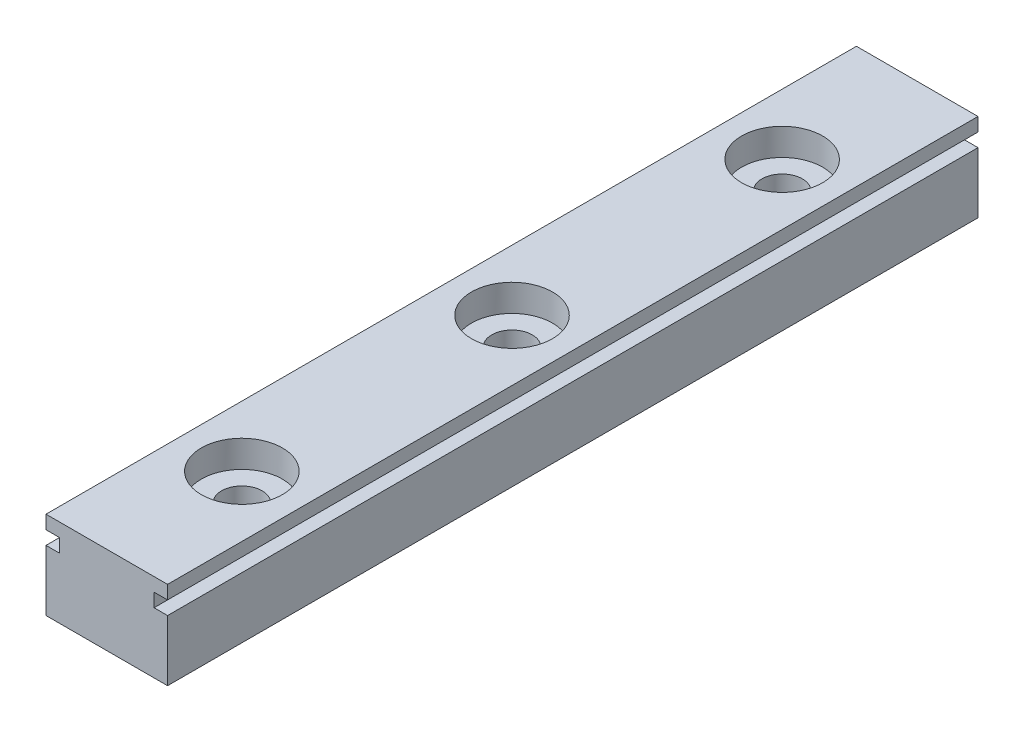
ISO-10303-21;
HEADER;
FILE_DESCRIPTION(('STEP AP214'),'2;1');
FILE_NAME('part.step','',(''),(''),'','','');
FILE_SCHEMA(('AUTOMOTIVE_DESIGN { 1 0 10303 214 1 1 1 1 }'));
ENDSEC;
DATA;
#1=APPLICATION_CONTEXT('core data for automotive mechanical design processes');
#2=APPLICATION_PROTOCOL_DEFINITION('international standard','automotive_design',2000,#1);
#3=PRODUCT_CONTEXT('',#1,'mechanical');
#4=PRODUCT('Part','Part','',(#3));
#5=PRODUCT_RELATED_PRODUCT_CATEGORY('part','',(#4));
#6=PRODUCT_DEFINITION_FORMATION('','',#4);
#7=PRODUCT_DEFINITION_CONTEXT('part definition',#1,'design');
#8=PRODUCT_DEFINITION('design','',#6,#7);
#9=PRODUCT_DEFINITION_SHAPE('','',#8);
#10=(LENGTH_UNIT() NAMED_UNIT(*) SI_UNIT(.MILLI.,.METRE.));
#11=(NAMED_UNIT(*) PLANE_ANGLE_UNIT() SI_UNIT($,.RADIAN.));
#12=(NAMED_UNIT(*) SI_UNIT($,.STERADIAN.) SOLID_ANGLE_UNIT());
#13=UNCERTAINTY_MEASURE_WITH_UNIT(LENGTH_MEASURE(1.E-05),#10,'distance_accuracy_value','');
#14=(GEOMETRIC_REPRESENTATION_CONTEXT(3) GLOBAL_UNCERTAINTY_ASSIGNED_CONTEXT((#13)) GLOBAL_UNIT_ASSIGNED_CONTEXT((#10,
#11,#12)) REPRESENTATION_CONTEXT('',''));
#15=CARTESIAN_POINT('',(0.,0.,0.));
#16=DIRECTION('',(0.,0.,1.));
#17=DIRECTION('',(1.,0.,0.));
#18=AXIS2_PLACEMENT_3D('',#15,#16,#17);
#19=CARTESIAN_POINT('',(3.5,5.5,60.));
#20=DIRECTION('',(-1.,0.,0.));
#21=DIRECTION('',(0.,0.,1.));
#22=AXIS2_PLACEMENT_3D('',#19,#20,#21);
#23=PLANE('',#22);
#24=DIRECTION('',(0.,1.,0.));
#25=VECTOR('',#24,1.);
#26=CARTESIAN_POINT('',(3.5,5.5,0.));
#27=LINE('',#26,#25);
#28=CARTESIAN_POINT('',(3.5,4.5,0.));
#29=VERTEX_POINT('',#28);
#30=CARTESIAN_POINT('',(3.5,5.5,0.));
#31=VERTEX_POINT('',#30);
#32=EDGE_CURVE('E157',#29,#31,#27,.T.);
#33=ORIENTED_EDGE('',*,*,#32,.T.);
#34=DIRECTION('',(0.,0.,-1.));
#35=VECTOR('',#34,1.);
#36=CARTESIAN_POINT('',(3.5,5.5,60.));
#37=LINE('',#36,#35);
#38=CARTESIAN_POINT('',(3.5,5.5,60.));
#39=VERTEX_POINT('',#38);
#40=EDGE_CURVE('E11',#39,#31,#37,.T.);
#41=ORIENTED_EDGE('',*,*,#40,.F.);
#42=DIRECTION('',(0.,1.,0.));
#43=VECTOR('',#42,1.);
#44=CARTESIAN_POINT('',(3.5,5.5,60.));
#45=LINE('',#44,#43);
#46=CARTESIAN_POINT('',(3.5,4.5,60.));
#47=VERTEX_POINT('',#46);
#48=EDGE_CURVE('E180',#47,#39,#45,.T.);
#49=ORIENTED_EDGE('',*,*,#48,.F.);
#50=DIRECTION('',(0.,0.,-1.));
#51=VECTOR('',#50,1.);
#52=CARTESIAN_POINT('',(3.5,4.5,60.));
#53=LINE('',#52,#51);
#54=EDGE_CURVE('E153',#47,#29,#53,.T.);
#55=ORIENTED_EDGE('',*,*,#54,.T.);
#56=EDGE_LOOP('',(#33,#41,#49,#55));
#57=FACE_BOUND('',#56,.T.);
#58=ADVANCED_FACE('F37',(#57),#23,.F.);
#59=CARTESIAN_POINT('',(4.5,5.5,60.));
#60=DIRECTION('',(0.,1.,0.));
#61=DIRECTION('',(-1.,0.,0.));
#62=AXIS2_PLACEMENT_3D('',#59,#60,#61);
#63=PLANE('',#62);
#64=DIRECTION('',(1.,0.,0.));
#65=VECTOR('',#64,1.);
#66=CARTESIAN_POINT('',(4.5,5.5,0.));
#67=LINE('',#66,#65);
#68=CARTESIAN_POINT('',(4.5,5.5,0.));
#69=VERTEX_POINT('',#68);
#70=EDGE_CURVE('E160',#31,#69,#67,.T.);
#71=ORIENTED_EDGE('',*,*,#70,.T.);
#72=DIRECTION('',(0.,0.,-1.));
#73=VECTOR('',#72,1.);
#74=CARTESIAN_POINT('',(4.5,5.5,60.));
#75=LINE('',#74,#73);
#76=CARTESIAN_POINT('',(4.5,5.5,60.));
#77=VERTEX_POINT('',#76);
#78=EDGE_CURVE('E45',#77,#69,#75,.T.);
#79=ORIENTED_EDGE('',*,*,#78,.F.);
#80=DIRECTION('',(1.,0.,0.));
#81=VECTOR('',#80,1.);
#82=CARTESIAN_POINT('',(4.5,5.5,60.));
#83=LINE('',#82,#81);
#84=EDGE_CURVE('E108',#39,#77,#83,.T.);
#85=ORIENTED_EDGE('',*,*,#84,.F.);
#86=ORIENTED_EDGE('',*,*,#40,.T.);
#87=EDGE_LOOP('',(#71,#79,#85,#86));
#88=FACE_BOUND('',#87,.T.);
#89=ADVANCED_FACE('F258',(#88),#63,.F.);
#90=CARTESIAN_POINT('',(4.5,6.5,60.));
#91=DIRECTION('',(-1.,0.,0.));
#92=DIRECTION('',(0.,0.,1.));
#93=AXIS2_PLACEMENT_3D('',#90,#91,#92);
#94=PLANE('',#93);
#95=DIRECTION('',(0.,1.,0.));
#96=VECTOR('',#95,1.);
#97=CARTESIAN_POINT('',(4.5,6.5,0.));
#98=LINE('',#97,#96);
#99=CARTESIAN_POINT('',(4.5,6.5,0.));
#100=VERTEX_POINT('',#99);
#101=EDGE_CURVE('E163',#69,#100,#98,.T.);
#102=ORIENTED_EDGE('',*,*,#101,.T.);
#103=DIRECTION('',(0.,0.,-1.));
#104=VECTOR('',#103,1.);
#105=CARTESIAN_POINT('',(4.5,6.5,60.));
#106=LINE('',#105,#104);
#107=CARTESIAN_POINT('',(4.5,6.5,60.));
#108=VERTEX_POINT('',#107);
#109=EDGE_CURVE('E199',#108,#100,#106,.T.);
#110=ORIENTED_EDGE('',*,*,#109,.F.);
#111=DIRECTION('',(0.,1.,0.));
#112=VECTOR('',#111,1.);
#113=CARTESIAN_POINT('',(4.5,6.5,60.));
#114=LINE('',#113,#112);
#115=EDGE_CURVE('E207',#77,#108,#114,.T.);
#116=ORIENTED_EDGE('',*,*,#115,.F.);
#117=ORIENTED_EDGE('',*,*,#78,.T.);
#118=EDGE_LOOP('',(#102,#110,#116,#117));
#119=FACE_BOUND('',#118,.T.);
#120=ADVANCED_FACE('F205',(#119),#94,.F.);
#121=CARTESIAN_POINT('',(4.5,6.5,60.));
#122=DIRECTION('',(0.,-1.,0.));
#123=DIRECTION('',(0.,0.,-1.));
#124=AXIS2_PLACEMENT_3D('',#121,#122,#123);
#125=PLANE('',#124);
#126=CARTESIAN_POINT('',(0.,6.5,10.));
#127=DIRECTION('',(0.,1.,0.));
#128=DIRECTION('',(0.,0.,1.));
#129=AXIS2_PLACEMENT_3D('',#126,#127,#128);
#130=CIRCLE('',#129,3.);
#131=CARTESIAN_POINT('',(0.,6.5,13.));
#132=VERTEX_POINT('',#131);
#133=EDGE_CURVE('E312',#132,#132,#130,.T.);
#134=ORIENTED_EDGE('',*,*,#133,.F.);
#135=EDGE_LOOP('',(#134));
#136=FACE_BOUND('',#135,.T.);
#137=CARTESIAN_POINT('',(2.09488880330588E-13,6.5,30.));
#138=DIRECTION('',(0.,1.,0.));
#139=DIRECTION('',(0.,0.,1.));
#140=AXIS2_PLACEMENT_3D('',#137,#138,#139);
#141=CIRCLE('',#140,3.);
#142=CARTESIAN_POINT('',(2.09488880330588E-13,6.5,33.));
#143=VERTEX_POINT('',#142);
#144=EDGE_CURVE('E324',#143,#143,#141,.T.);
#145=ORIENTED_EDGE('',*,*,#144,.F.);
#146=EDGE_LOOP('',(#145));
#147=FACE_BOUND('',#146,.T.);
#148=CARTESIAN_POINT('',(4.18977760661176E-13,6.5,50.));
#149=DIRECTION('',(0.,1.,0.));
#150=DIRECTION('',(0.,0.,1.));
#151=AXIS2_PLACEMENT_3D('',#148,#149,#150);
#152=CIRCLE('',#151,3.);
#153=CARTESIAN_POINT('',(4.18977760661176E-13,6.5,53.));
#154=VERTEX_POINT('',#153);
#155=EDGE_CURVE('E318',#154,#154,#152,.T.);
#156=ORIENTED_EDGE('',*,*,#155,.F.);
#157=EDGE_LOOP('',(#156));
#158=FACE_BOUND('',#157,.T.);
#159=DIRECTION('',(-1.,0.,0.));
#160=VECTOR('',#159,1.);
#161=CARTESIAN_POINT('',(4.5,6.5,0.));
#162=LINE('',#161,#160);
#163=CARTESIAN_POINT('',(-4.5,6.5,0.));
#164=VERTEX_POINT('',#163);
#165=EDGE_CURVE('E165',#100,#164,#162,.T.);
#166=ORIENTED_EDGE('',*,*,#165,.T.);
#167=DIRECTION('',(0.,0.,-1.));
#168=VECTOR('',#167,1.);
#169=CARTESIAN_POINT('',(-4.5,6.5,60.));
#170=LINE('',#169,#168);
#171=CARTESIAN_POINT('',(-4.5,6.5,60.));
#172=VERTEX_POINT('',#171);
#173=EDGE_CURVE('E196',#172,#164,#170,.T.);
#174=ORIENTED_EDGE('',*,*,#173,.F.);
#175=DIRECTION('',(-1.,0.,0.));
#176=VECTOR('',#175,1.);
#177=CARTESIAN_POINT('',(4.5,6.5,60.));
#178=LINE('',#177,#176);
#179=EDGE_CURVE('E225',#108,#172,#178,.T.);
#180=ORIENTED_EDGE('',*,*,#179,.F.);
#181=ORIENTED_EDGE('',*,*,#109,.T.);
#182=EDGE_LOOP('',(#166,#174,#180,#181));
#183=FACE_BOUND('',#182,.T.);
#184=ADVANCED_FACE('F216',(#136,#147,#158,#183),#125,.F.);
#185=CARTESIAN_POINT('',(-4.5,6.5,60.));
#186=DIRECTION('',(1.,0.,0.));
#187=DIRECTION('',(0.,0.,-1.));
#188=AXIS2_PLACEMENT_3D('',#185,#186,#187);
#189=PLANE('',#188);
#190=DIRECTION('',(0.,-1.,0.));
#191=VECTOR('',#190,1.);
#192=CARTESIAN_POINT('',(-4.5,6.5,0.));
#193=LINE('',#192,#191);
#194=CARTESIAN_POINT('',(-4.5,5.5,0.));
#195=VERTEX_POINT('',#194);
#196=EDGE_CURVE('E167',#164,#195,#193,.T.);
#197=ORIENTED_EDGE('',*,*,#196,.T.);
#198=DIRECTION('',(0.,0.,-1.));
#199=VECTOR('',#198,1.);
#200=CARTESIAN_POINT('',(-4.5,5.5,60.));
#201=LINE('',#200,#199);
#202=CARTESIAN_POINT('',(-4.5,5.5,60.));
#203=VERTEX_POINT('',#202);
#204=EDGE_CURVE('E193',#203,#195,#201,.T.);
#205=ORIENTED_EDGE('',*,*,#204,.F.);
#206=DIRECTION('',(0.,-1.,0.));
#207=VECTOR('',#206,1.);
#208=CARTESIAN_POINT('',(-4.5,6.5,60.));
#209=LINE('',#208,#207);
#210=EDGE_CURVE('E222',#172,#203,#209,.T.);
#211=ORIENTED_EDGE('',*,*,#210,.F.);
#212=ORIENTED_EDGE('',*,*,#173,.T.);
#213=EDGE_LOOP('',(#197,#205,#211,#212));
#214=FACE_BOUND('',#213,.T.);
#215=ADVANCED_FACE('F220',(#214),#189,.F.);
#216=CARTESIAN_POINT('',(-4.5,5.5,60.));
#217=DIRECTION('',(0.,1.,0.));
#218=DIRECTION('',(-1.,0.,0.));
#219=AXIS2_PLACEMENT_3D('',#216,#217,#218);
#220=PLANE('',#219);
#221=DIRECTION('',(1.,0.,0.));
#222=VECTOR('',#221,1.);
#223=CARTESIAN_POINT('',(-4.5,5.5,0.));
#224=LINE('',#223,#222);
#225=CARTESIAN_POINT('',(-3.5,5.5,0.));
#226=VERTEX_POINT('',#225);
#227=EDGE_CURVE('E169',#195,#226,#224,.T.);
#228=ORIENTED_EDGE('',*,*,#227,.T.);
#229=DIRECTION('',(0.,0.,-1.));
#230=VECTOR('',#229,1.);
#231=CARTESIAN_POINT('',(-3.5,5.5,60.));
#232=LINE('',#231,#230);
#233=CARTESIAN_POINT('',(-3.5,5.5,60.));
#234=VERTEX_POINT('',#233);
#235=EDGE_CURVE('E190',#234,#226,#232,.T.);
#236=ORIENTED_EDGE('',*,*,#235,.F.);
#237=DIRECTION('',(1.,0.,0.));
#238=VECTOR('',#237,1.);
#239=CARTESIAN_POINT('',(-4.5,5.5,60.));
#240=LINE('',#239,#238);
#241=EDGE_CURVE('E224',#203,#234,#240,.T.);
#242=ORIENTED_EDGE('',*,*,#241,.F.);
#243=ORIENTED_EDGE('',*,*,#204,.T.);
#244=EDGE_LOOP('',(#228,#236,#242,#243));
#245=FACE_BOUND('',#244,.T.);
#246=ADVANCED_FACE('F272',(#245),#220,.F.);
#247=CARTESIAN_POINT('',(-3.5,5.5,60.));
#248=DIRECTION('',(1.,0.,0.));
#249=DIRECTION('',(0.,0.,-1.));
#250=AXIS2_PLACEMENT_3D('',#247,#248,#249);
#251=PLANE('',#250);
#252=DIRECTION('',(0.,-1.,0.));
#253=VECTOR('',#252,1.);
#254=CARTESIAN_POINT('',(-3.5,5.5,0.));
#255=LINE('',#254,#253);
#256=CARTESIAN_POINT('',(-3.5,4.5,0.));
#257=VERTEX_POINT('',#256);
#258=EDGE_CURVE('E171',#226,#257,#255,.T.);
#259=ORIENTED_EDGE('',*,*,#258,.T.);
#260=DIRECTION('',(0.,0.,-1.));
#261=VECTOR('',#260,1.);
#262=CARTESIAN_POINT('',(-3.5,4.5,60.));
#263=LINE('',#262,#261);
#264=CARTESIAN_POINT('',(-3.5,4.5,60.));
#265=VERTEX_POINT('',#264);
#266=EDGE_CURVE('E187',#265,#257,#263,.T.);
#267=ORIENTED_EDGE('',*,*,#266,.F.);
#268=DIRECTION('',(0.,-1.,0.));
#269=VECTOR('',#268,1.);
#270=CARTESIAN_POINT('',(-3.5,5.5,60.));
#271=LINE('',#270,#269);
#272=EDGE_CURVE('E227',#234,#265,#271,.T.);
#273=ORIENTED_EDGE('',*,*,#272,.F.);
#274=ORIENTED_EDGE('',*,*,#235,.T.);
#275=EDGE_LOOP('',(#259,#267,#273,#274));
#276=FACE_BOUND('',#275,.T.);
#277=ADVANCED_FACE('F275',(#276),#251,.F.);
#278=CARTESIAN_POINT('',(-3.5,4.5,60.));
#279=DIRECTION('',(0.,-1.,0.));
#280=DIRECTION('',(0.,0.,-1.));
#281=AXIS2_PLACEMENT_3D('',#278,#279,#280);
#282=PLANE('',#281);
#283=DIRECTION('',(-1.,0.,0.));
#284=VECTOR('',#283,1.);
#285=CARTESIAN_POINT('',(-3.5,4.5,0.));
#286=LINE('',#285,#284);
#287=CARTESIAN_POINT('',(-4.5,4.5,0.));
#288=VERTEX_POINT('',#287);
#289=EDGE_CURVE('E173',#257,#288,#286,.T.);
#290=ORIENTED_EDGE('',*,*,#289,.T.);
#291=DIRECTION('',(0.,0.,-1.));
#292=VECTOR('',#291,1.);
#293=CARTESIAN_POINT('',(-4.5,4.5,60.));
#294=LINE('',#293,#292);
#295=CARTESIAN_POINT('',(-4.5,4.5,60.));
#296=VERTEX_POINT('',#295);
#297=EDGE_CURVE('E184',#296,#288,#294,.T.);
#298=ORIENTED_EDGE('',*,*,#297,.F.);
#299=DIRECTION('',(-1.,0.,0.));
#300=VECTOR('',#299,1.);
#301=CARTESIAN_POINT('',(-3.5,4.5,60.));
#302=LINE('',#301,#300);
#303=EDGE_CURVE('E233',#265,#296,#302,.T.);
#304=ORIENTED_EDGE('',*,*,#303,.F.);
#305=ORIENTED_EDGE('',*,*,#266,.T.);
#306=EDGE_LOOP('',(#290,#298,#304,#305));
#307=FACE_BOUND('',#306,.T.);
#308=ADVANCED_FACE('F239',(#307),#282,.F.);
#309=CARTESIAN_POINT('',(-4.5,4.5,60.));
#310=DIRECTION('',(1.,0.,0.));
#311=DIRECTION('',(0.,1.,0.));
#312=AXIS2_PLACEMENT_3D('',#309,#310,#311);
#313=PLANE('',#312);
#314=DIRECTION('',(0.,-1.,0.));
#315=VECTOR('',#314,1.);
#316=CARTESIAN_POINT('',(-4.5,4.5,0.));
#317=LINE('',#316,#315);
#318=CARTESIAN_POINT('',(-4.5,0.,0.));
#319=VERTEX_POINT('',#318);
#320=EDGE_CURVE('E175',#288,#319,#317,.T.);
#321=ORIENTED_EDGE('',*,*,#320,.T.);
#322=DIRECTION('',(0.,0.,-1.));
#323=VECTOR('',#322,1.);
#324=CARTESIAN_POINT('',(-4.5,0.,60.));
#325=LINE('',#324,#323);
#326=CARTESIAN_POINT('',(-4.5,0.,60.));
#327=VERTEX_POINT('',#326);
#328=EDGE_CURVE('E148',#327,#319,#325,.T.);
#329=ORIENTED_EDGE('',*,*,#328,.F.);
#330=DIRECTION('',(0.,-1.,0.));
#331=VECTOR('',#330,1.);
#332=CARTESIAN_POINT('',(-4.5,4.5,60.));
#333=LINE('',#332,#331);
#334=EDGE_CURVE('E139',#296,#327,#333,.T.);
#335=ORIENTED_EDGE('',*,*,#334,.F.);
#336=ORIENTED_EDGE('',*,*,#297,.T.);
#337=EDGE_LOOP('',(#321,#329,#335,#336));
#338=FACE_BOUND('',#337,.T.);
#339=ADVANCED_FACE('F243',(#338),#313,.F.);
#340=CARTESIAN_POINT('',(-4.5,0.,60.));
#341=DIRECTION('',(0.,1.,0.));
#342=DIRECTION('',(0.,0.,1.));
#343=AXIS2_PLACEMENT_3D('',#340,#341,#342);
#344=PLANE('',#343);
#345=CARTESIAN_POINT('',(0.,0.,10.));
#346=DIRECTION('',(0.,1.,0.));
#347=DIRECTION('',(0.,0.,1.));
#348=AXIS2_PLACEMENT_3D('',#345,#346,#347);
#349=CIRCLE('',#348,1.5);
#350=CARTESIAN_POINT('',(0.,0.,11.5));
#351=VERTEX_POINT('',#350);
#352=EDGE_CURVE('E291',#351,#351,#349,.T.);
#353=ORIENTED_EDGE('',*,*,#352,.T.);
#354=EDGE_LOOP('',(#353));
#355=FACE_BOUND('',#354,.T.);
#356=CARTESIAN_POINT('',(2.09488880330588E-13,0.,30.));
#357=DIRECTION('',(0.,1.,0.));
#358=DIRECTION('',(0.,0.,1.));
#359=AXIS2_PLACEMENT_3D('',#356,#357,#358);
#360=CIRCLE('',#359,1.5);
#361=CARTESIAN_POINT('',(2.09488880330588E-13,0.,31.5));
#362=VERTEX_POINT('',#361);
#363=EDGE_CURVE('E295',#362,#362,#360,.T.);
#364=ORIENTED_EDGE('',*,*,#363,.T.);
#365=EDGE_LOOP('',(#364));
#366=FACE_BOUND('',#365,.T.);
#367=CARTESIAN_POINT('',(4.18977760661176E-13,0.,50.));
#368=DIRECTION('',(0.,1.,0.));
#369=DIRECTION('',(0.,0.,1.));
#370=AXIS2_PLACEMENT_3D('',#367,#368,#369);
#371=CIRCLE('',#370,1.5);
#372=CARTESIAN_POINT('',(4.18977760661176E-13,0.,51.5));
#373=VERTEX_POINT('',#372);
#374=EDGE_CURVE('E298',#373,#373,#371,.T.);
#375=ORIENTED_EDGE('',*,*,#374,.T.);
#376=EDGE_LOOP('',(#375));
#377=FACE_BOUND('',#376,.T.);
#378=DIRECTION('',(1.,0.,0.));
#379=VECTOR('',#378,1.);
#380=CARTESIAN_POINT('',(-4.5,0.,0.));
#381=LINE('',#380,#379);
#382=CARTESIAN_POINT('',(4.5,0.,0.));
#383=VERTEX_POINT('',#382);
#384=EDGE_CURVE('E147',#319,#383,#381,.T.);
#385=ORIENTED_EDGE('',*,*,#384,.T.);
#386=DIRECTION('',(0.,0.,-1.));
#387=VECTOR('',#386,1.);
#388=CARTESIAN_POINT('',(4.5,0.,60.));
#389=LINE('',#388,#387);
#390=CARTESIAN_POINT('',(4.5,0.,60.));
#391=VERTEX_POINT('',#390);
#392=EDGE_CURVE('E144',#391,#383,#389,.T.);
#393=ORIENTED_EDGE('',*,*,#392,.F.);
#394=DIRECTION('',(1.,0.,0.));
#395=VECTOR('',#394,1.);
#396=CARTESIAN_POINT('',(-4.5,0.,60.));
#397=LINE('',#396,#395);
#398=EDGE_CURVE('E133',#327,#391,#397,.T.);
#399=ORIENTED_EDGE('',*,*,#398,.F.);
#400=ORIENTED_EDGE('',*,*,#328,.T.);
#401=EDGE_LOOP('',(#385,#393,#399,#400));
#402=FACE_BOUND('',#401,.T.);
#403=ADVANCED_FACE('F145',(#355,#366,#377,#402),#344,.F.);
#404=CARTESIAN_POINT('',(4.5,4.5,60.));
#405=DIRECTION('',(-1.,0.,0.));
#406=DIRECTION('',(0.,-1.,0.));
#407=AXIS2_PLACEMENT_3D('',#404,#405,#406);
#408=PLANE('',#407);
#409=DIRECTION('',(0.,1.,0.));
#410=VECTOR('',#409,1.);
#411=CARTESIAN_POINT('',(4.5,4.5,0.));
#412=LINE('',#411,#410);
#413=CARTESIAN_POINT('',(4.5,4.5,0.));
#414=VERTEX_POINT('',#413);
#415=EDGE_CURVE('E94',#383,#414,#412,.T.);
#416=ORIENTED_EDGE('',*,*,#415,.T.);
#417=DIRECTION('',(0.,0.,-1.));
#418=VECTOR('',#417,1.);
#419=CARTESIAN_POINT('',(4.5,4.5,60.));
#420=LINE('',#419,#418);
#421=CARTESIAN_POINT('',(4.5,4.5,60.));
#422=VERTEX_POINT('',#421);
#423=EDGE_CURVE('E149',#422,#414,#420,.T.);
#424=ORIENTED_EDGE('',*,*,#423,.F.);
#425=DIRECTION('',(0.,1.,0.));
#426=VECTOR('',#425,1.);
#427=CARTESIAN_POINT('',(4.5,4.5,60.));
#428=LINE('',#427,#426);
#429=EDGE_CURVE('E137',#391,#422,#428,.T.);
#430=ORIENTED_EDGE('',*,*,#429,.F.);
#431=ORIENTED_EDGE('',*,*,#392,.T.);
#432=EDGE_LOOP('',(#416,#424,#430,#431));
#433=FACE_BOUND('',#432,.T.);
#434=ADVANCED_FACE('F151',(#433),#408,.F.);
#435=CARTESIAN_POINT('',(3.5,4.5,60.));
#436=DIRECTION('',(0.,-1.,0.));
#437=DIRECTION('',(0.,0.,-1.));
#438=AXIS2_PLACEMENT_3D('',#435,#436,#437);
#439=PLANE('',#438);
#440=DIRECTION('',(-1.,0.,0.));
#441=VECTOR('',#440,1.);
#442=CARTESIAN_POINT('',(3.5,4.5,0.));
#443=LINE('',#442,#441);
#444=EDGE_CURVE('E100',#414,#29,#443,.T.);
#445=ORIENTED_EDGE('',*,*,#444,.T.);
#446=ORIENTED_EDGE('',*,*,#54,.F.);
#447=DIRECTION('',(-1.,0.,0.));
#448=VECTOR('',#447,1.);
#449=CARTESIAN_POINT('',(3.5,4.5,60.));
#450=LINE('',#449,#448);
#451=EDGE_CURVE('E53',#422,#47,#450,.T.);
#452=ORIENTED_EDGE('',*,*,#451,.F.);
#453=ORIENTED_EDGE('',*,*,#423,.T.);
#454=EDGE_LOOP('',(#445,#446,#452,#453));
#455=FACE_BOUND('',#454,.T.);
#456=ADVANCED_FACE('F247',(#455),#439,.F.);
#457=CARTESIAN_POINT('',(0.,0.,60.));
#458=DIRECTION('',(0.,0.,1.));
#459=DIRECTION('',(1.,0.,0.));
#460=AXIS2_PLACEMENT_3D('',#457,#458,#459);
#461=PLANE('',#460);
#462=ORIENTED_EDGE('',*,*,#48,.T.);
#463=ORIENTED_EDGE('',*,*,#84,.T.);
#464=ORIENTED_EDGE('',*,*,#115,.T.);
#465=ORIENTED_EDGE('',*,*,#179,.T.);
#466=ORIENTED_EDGE('',*,*,#210,.T.);
#467=ORIENTED_EDGE('',*,*,#241,.T.);
#468=ORIENTED_EDGE('',*,*,#272,.T.);
#469=ORIENTED_EDGE('',*,*,#303,.T.);
#470=ORIENTED_EDGE('',*,*,#334,.T.);
#471=ORIENTED_EDGE('',*,*,#398,.T.);
#472=ORIENTED_EDGE('',*,*,#429,.T.);
#473=ORIENTED_EDGE('',*,*,#451,.T.);
#474=EDGE_LOOP('',(#462,#463,#464,#465,#466,#467,#468,#469,#470,#471,#472,#473));
#475=FACE_BOUND('',#474,.T.);
#476=ADVANCED_FACE('F135',(#475),#461,.T.);
#477=CARTESIAN_POINT('',(0.,0.,0.));
#478=DIRECTION('',(0.,0.,1.));
#479=DIRECTION('',(1.,0.,0.));
#480=AXIS2_PLACEMENT_3D('',#477,#478,#479);
#481=PLANE('',#480);
#482=ORIENTED_EDGE('',*,*,#32,.F.);
#483=ORIENTED_EDGE('',*,*,#444,.F.);
#484=ORIENTED_EDGE('',*,*,#415,.F.);
#485=ORIENTED_EDGE('',*,*,#384,.F.);
#486=ORIENTED_EDGE('',*,*,#320,.F.);
#487=ORIENTED_EDGE('',*,*,#289,.F.);
#488=ORIENTED_EDGE('',*,*,#258,.F.);
#489=ORIENTED_EDGE('',*,*,#227,.F.);
#490=ORIENTED_EDGE('',*,*,#196,.F.);
#491=ORIENTED_EDGE('',*,*,#165,.F.);
#492=ORIENTED_EDGE('',*,*,#101,.F.);
#493=ORIENTED_EDGE('',*,*,#70,.F.);
#494=EDGE_LOOP('',(#482,#483,#484,#485,#486,#487,#488,#489,#490,#491,#492,#493));
#495=FACE_BOUND('',#494,.T.);
#496=ADVANCED_FACE('F211',(#495),#481,.F.);
#497=CARTESIAN_POINT('',(3.5,4.5,60.));
#498=DIRECTION('',(0.,-1.,0.));
#499=DIRECTION('',(0.,0.,-1.));
#500=AXIS2_PLACEMENT_3D('',#497,#498,#499);
#501=PLANE('',#500);
#502=CARTESIAN_POINT('',(4.18977760661176E-13,4.5,50.));
#503=DIRECTION('',(0.,1.,0.));
#504=DIRECTION('',(0.,0.,1.));
#505=AXIS2_PLACEMENT_3D('',#502,#503,#504);
#506=CIRCLE('',#505,1.5);
#507=CARTESIAN_POINT('',(4.18977760661176E-13,4.5,51.5));
#508=VERTEX_POINT('',#507);
#509=EDGE_CURVE('E301',#508,#508,#506,.T.);
#510=ORIENTED_EDGE('',*,*,#509,.F.);
#511=EDGE_LOOP('',(#510));
#512=FACE_BOUND('',#511,.T.);
#513=CARTESIAN_POINT('',(4.18977760661176E-13,4.5,50.));
#514=DIRECTION('',(0.,-1.,0.));
#515=DIRECTION('',(0.,0.,-1.));
#516=AXIS2_PLACEMENT_3D('',#513,#514,#515);
#517=CIRCLE('',#516,3.);
#518=CARTESIAN_POINT('',(4.18977760661176E-13,4.5,47.));
#519=VERTEX_POINT('',#518);
#520=EDGE_CURVE('E321',#519,#519,#517,.F.);
#521=ORIENTED_EDGE('',*,*,#520,.T.);
#522=EDGE_LOOP('',(#521));
#523=FACE_BOUND('',#522,.T.);
#524=ADVANCED_FACE('F350',(#512,#523),#501,.F.);
#525=CARTESIAN_POINT('',(4.18977760661176E-13,-3.98528137423858,50.));
#526=DIRECTION('',(0.,1.,0.));
#527=DIRECTION('',(0.,0.,1.));
#528=AXIS2_PLACEMENT_3D('',#525,#526,#527);
#529=CYLINDRICAL_SURFACE('',#528,3.);
#530=ORIENTED_EDGE('',*,*,#155,.T.);
#531=EDGE_LOOP('',(#530));
#532=FACE_BOUND('',#531,.T.);
#533=ORIENTED_EDGE('',*,*,#520,.F.);
#534=EDGE_LOOP('',(#533));
#535=FACE_BOUND('',#534,.T.);
#536=ADVANCED_FACE('F346',(#532,#535),#529,.F.);
#537=CARTESIAN_POINT('',(3.5,4.5,60.));
#538=DIRECTION('',(0.,-1.,0.));
#539=DIRECTION('',(0.,0.,-1.));
#540=AXIS2_PLACEMENT_3D('',#537,#538,#539);
#541=PLANE('',#540);
#542=CARTESIAN_POINT('',(2.09488880330588E-13,4.5,30.));
#543=DIRECTION('',(0.,1.,0.));
#544=DIRECTION('',(0.,0.,1.));
#545=AXIS2_PLACEMENT_3D('',#542,#543,#544);
#546=CIRCLE('',#545,1.5);
#547=CARTESIAN_POINT('',(2.09488880330588E-13,4.5,31.5));
#548=VERTEX_POINT('',#547);
#549=EDGE_CURVE('E300',#548,#548,#546,.T.);
#550=ORIENTED_EDGE('',*,*,#549,.F.);
#551=EDGE_LOOP('',(#550));
#552=FACE_BOUND('',#551,.T.);
#553=CARTESIAN_POINT('',(2.09488880330588E-13,4.5,30.));
#554=DIRECTION('',(0.,-1.,0.));
#555=DIRECTION('',(0.,0.,-1.));
#556=AXIS2_PLACEMENT_3D('',#553,#554,#555);
#557=CIRCLE('',#556,3.);
#558=CARTESIAN_POINT('',(2.09488880330588E-13,4.5,27.));
#559=VERTEX_POINT('',#558);
#560=EDGE_CURVE('E315',#559,#559,#557,.F.);
#561=ORIENTED_EDGE('',*,*,#560,.T.);
#562=EDGE_LOOP('',(#561));
#563=FACE_BOUND('',#562,.T.);
#564=ADVANCED_FACE('F332',(#552,#563),#541,.F.);
#565=CARTESIAN_POINT('',(2.09488880330588E-13,-3.98528137423858,30.));
#566=DIRECTION('',(0.,1.,0.));
#567=DIRECTION('',(0.,0.,1.));
#568=AXIS2_PLACEMENT_3D('',#565,#566,#567);
#569=CYLINDRICAL_SURFACE('',#568,3.);
#570=ORIENTED_EDGE('',*,*,#144,.T.);
#571=EDGE_LOOP('',(#570));
#572=FACE_BOUND('',#571,.T.);
#573=ORIENTED_EDGE('',*,*,#560,.F.);
#574=EDGE_LOOP('',(#573));
#575=FACE_BOUND('',#574,.T.);
#576=ADVANCED_FACE('F334',(#572,#575),#569,.F.);
#577=CARTESIAN_POINT('',(3.5,4.5,60.));
#578=DIRECTION('',(0.,-1.,0.));
#579=DIRECTION('',(0.,0.,-1.));
#580=AXIS2_PLACEMENT_3D('',#577,#578,#579);
#581=PLANE('',#580);
#582=CARTESIAN_POINT('',(0.,4.5,10.));
#583=DIRECTION('',(0.,1.,0.));
#584=DIRECTION('',(0.,0.,1.));
#585=AXIS2_PLACEMENT_3D('',#582,#583,#584);
#586=CIRCLE('',#585,1.5);
#587=CARTESIAN_POINT('',(0.,4.5,11.5));
#588=VERTEX_POINT('',#587);
#589=EDGE_CURVE('E308',#588,#588,#586,.T.);
#590=ORIENTED_EDGE('',*,*,#589,.F.);
#591=EDGE_LOOP('',(#590));
#592=FACE_BOUND('',#591,.T.);
#593=CARTESIAN_POINT('',(0.,4.5,10.));
#594=DIRECTION('',(0.,-1.,0.));
#595=DIRECTION('',(0.,0.,-1.));
#596=AXIS2_PLACEMENT_3D('',#593,#594,#595);
#597=CIRCLE('',#596,3.);
#598=CARTESIAN_POINT('',(0.,4.5,7.));
#599=VERTEX_POINT('',#598);
#600=EDGE_CURVE('E161',#599,#599,#597,.F.);
#601=ORIENTED_EDGE('',*,*,#600,.T.);
#602=EDGE_LOOP('',(#601));
#603=FACE_BOUND('',#602,.T.);
#604=ADVANCED_FACE('F336',(#592,#603),#581,.F.);
#605=CARTESIAN_POINT('',(0.,-3.98528137423858,10.));
#606=DIRECTION('',(0.,1.,0.));
#607=DIRECTION('',(0.,0.,1.));
#608=AXIS2_PLACEMENT_3D('',#605,#606,#607);
#609=CYLINDRICAL_SURFACE('',#608,3.);
#610=ORIENTED_EDGE('',*,*,#133,.T.);
#611=EDGE_LOOP('',(#610));
#612=FACE_BOUND('',#611,.T.);
#613=ORIENTED_EDGE('',*,*,#600,.F.);
#614=EDGE_LOOP('',(#613));
#615=FACE_BOUND('',#614,.T.);
#616=ADVANCED_FACE('F343',(#612,#615),#609,.F.);
#617=CARTESIAN_POINT('',(4.18977760661176E-13,0.,50.));
#618=DIRECTION('',(0.,1.,0.));
#619=DIRECTION('',(0.,0.,1.));
#620=AXIS2_PLACEMENT_3D('',#617,#618,#619);
#621=CYLINDRICAL_SURFACE('',#620,1.5);
#622=ORIENTED_EDGE('',*,*,#374,.F.);
#623=EDGE_LOOP('',(#622));
#624=FACE_BOUND('',#623,.T.);
#625=ORIENTED_EDGE('',*,*,#509,.T.);
#626=EDGE_LOOP('',(#625));
#627=FACE_BOUND('',#626,.T.);
#628=ADVANCED_FACE('F366',(#624,#627),#621,.F.);
#629=CARTESIAN_POINT('',(2.09488880330588E-13,0.,30.));
#630=DIRECTION('',(0.,1.,0.));
#631=DIRECTION('',(0.,0.,1.));
#632=AXIS2_PLACEMENT_3D('',#629,#630,#631);
#633=CYLINDRICAL_SURFACE('',#632,1.5);
#634=ORIENTED_EDGE('',*,*,#363,.F.);
#635=EDGE_LOOP('',(#634));
#636=FACE_BOUND('',#635,.T.);
#637=ORIENTED_EDGE('',*,*,#549,.T.);
#638=EDGE_LOOP('',(#637));
#639=FACE_BOUND('',#638,.T.);
#640=ADVANCED_FACE('F368',(#636,#639),#633,.F.);
#641=CARTESIAN_POINT('',(0.,0.,10.));
#642=DIRECTION('',(0.,1.,0.));
#643=DIRECTION('',(0.,0.,1.));
#644=AXIS2_PLACEMENT_3D('',#641,#642,#643);
#645=CYLINDRICAL_SURFACE('',#644,1.5);
#646=ORIENTED_EDGE('',*,*,#352,.F.);
#647=EDGE_LOOP('',(#646));
#648=FACE_BOUND('',#647,.T.);
#649=ORIENTED_EDGE('',*,*,#589,.T.);
#650=EDGE_LOOP('',(#649));
#651=FACE_BOUND('',#650,.T.);
#652=ADVANCED_FACE('F374',(#648,#651),#645,.F.);
#653=CLOSED_SHELL('',(#58,#89,#120,#184,#215,#246,#277,#308,#339,#403,#434,#456,#476,#496,#524,
#536,#564,#576,#604,#616,#628,#640,#652));
#654=MANIFOLD_SOLID_BREP('B2',#653);
#655=ADVANCED_BREP_SHAPE_REPRESENTATION('',(#18,#654),#14);
#656=SHAPE_DEFINITION_REPRESENTATION(#9,#655);
ENDSEC;
END-ISO-10303-21;
